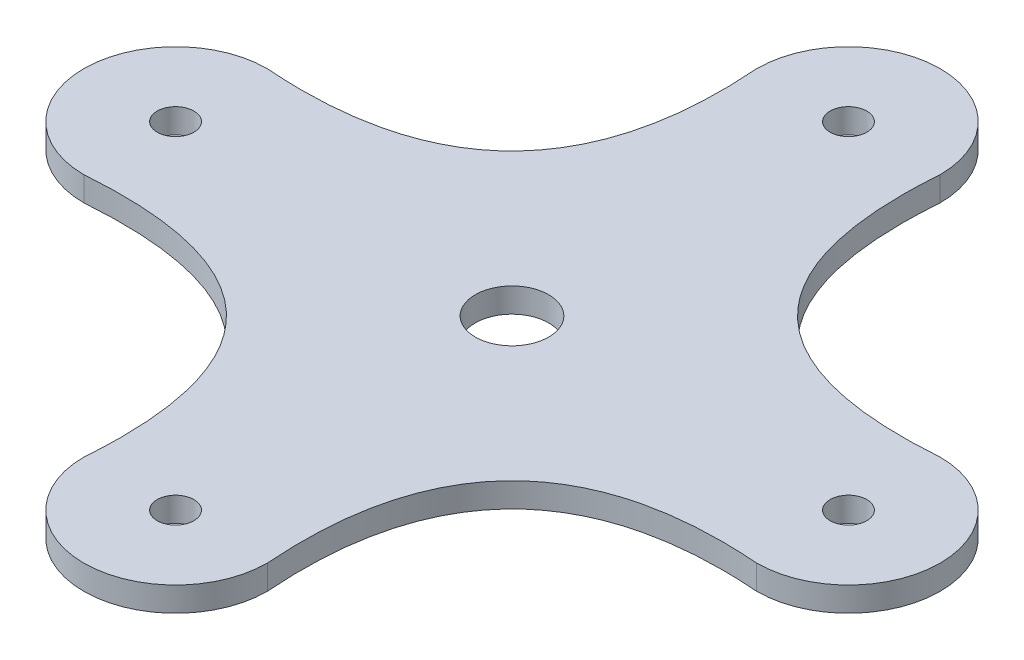
ISO-10303-21;
HEADER;
FILE_DESCRIPTION(('STEP AP214'),'2;1');
FILE_NAME('part.step','',(''),(''),'','','');
FILE_SCHEMA(('AUTOMOTIVE_DESIGN { 1 0 10303 214 1 1 1 1 }'));
ENDSEC;
DATA;
#1=APPLICATION_CONTEXT('core data for automotive mechanical design processes');
#2=APPLICATION_PROTOCOL_DEFINITION('international standard','automotive_design',2000,#1);
#3=PRODUCT_CONTEXT('',#1,'mechanical');
#4=PRODUCT('Part','Part','',(#3));
#5=PRODUCT_RELATED_PRODUCT_CATEGORY('part','',(#4));
#6=PRODUCT_DEFINITION_FORMATION('','',#4);
#7=PRODUCT_DEFINITION_CONTEXT('part definition',#1,'design');
#8=PRODUCT_DEFINITION('design','',#6,#7);
#9=PRODUCT_DEFINITION_SHAPE('','',#8);
#10=(LENGTH_UNIT() NAMED_UNIT(*) SI_UNIT(.MILLI.,.METRE.));
#11=(NAMED_UNIT(*) PLANE_ANGLE_UNIT() SI_UNIT($,.RADIAN.));
#12=(NAMED_UNIT(*) SI_UNIT($,.STERADIAN.) SOLID_ANGLE_UNIT());
#13=UNCERTAINTY_MEASURE_WITH_UNIT(LENGTH_MEASURE(1.E-05),#10,'distance_accuracy_value','');
#14=(GEOMETRIC_REPRESENTATION_CONTEXT(3) GLOBAL_UNCERTAINTY_ASSIGNED_CONTEXT((#13)) GLOBAL_UNIT_ASSIGNED_CONTEXT((#10,
#11,#12)) REPRESENTATION_CONTEXT('',''));
#15=CARTESIAN_POINT('',(0.,0.,0.));
#16=DIRECTION('',(0.,0.,1.));
#17=DIRECTION('',(1.,0.,0.));
#18=AXIS2_PLACEMENT_3D('',#15,#16,#17);
#19=CARTESIAN_POINT('',(27.5,2.,0.));
#20=DIRECTION('',(0.,-1.,0.));
#21=DIRECTION('',(0.,0.,-1.));
#22=AXIS2_PLACEMENT_3D('',#19,#20,#21);
#23=CYLINDRICAL_SURFACE('',#22,7.5);
#24=CARTESIAN_POINT('',(27.5,0.,0.));
#25=DIRECTION('',(0.,1.,0.));
#26=DIRECTION('',(0.,0.,1.));
#27=AXIS2_PLACEMENT_3D('',#24,#25,#26);
#28=CIRCLE('',#27,7.5);
#29=CARTESIAN_POINT('',(27.5,0.,7.5));
#30=VERTEX_POINT('',#29);
#31=CARTESIAN_POINT('',(27.5,0.,-7.5));
#32=VERTEX_POINT('',#31);
#33=EDGE_CURVE('E232',#30,#32,#28,.T.);
#34=ORIENTED_EDGE('',*,*,#33,.T.);
#35=DIRECTION('',(0.,-1.,0.));
#36=VECTOR('',#35,1.);
#37=CARTESIAN_POINT('',(27.5,2.,-7.5));
#38=LINE('',#37,#36);
#39=CARTESIAN_POINT('',(27.5,2.,-7.5));
#40=VERTEX_POINT('',#39);
#41=EDGE_CURVE('E11',#40,#32,#38,.T.);
#42=ORIENTED_EDGE('',*,*,#41,.F.);
#43=CARTESIAN_POINT('',(27.5,2.,0.));
#44=DIRECTION('',(0.,1.,0.));
#45=DIRECTION('',(0.,0.,1.));
#46=AXIS2_PLACEMENT_3D('',#43,#44,#45);
#47=CIRCLE('',#46,7.5);
#48=CARTESIAN_POINT('',(27.5,2.,7.5));
#49=VERTEX_POINT('',#48);
#50=EDGE_CURVE('E192',#49,#40,#47,.T.);
#51=ORIENTED_EDGE('',*,*,#50,.F.);
#52=DIRECTION('',(0.,-1.,0.));
#53=VECTOR('',#52,1.);
#54=CARTESIAN_POINT('',(27.5,2.,7.5));
#55=LINE('',#54,#53);
#56=EDGE_CURVE('E139',#49,#30,#55,.T.);
#57=ORIENTED_EDGE('',*,*,#56,.T.);
#58=EDGE_LOOP('',(#34,#42,#51,#57));
#59=FACE_BOUND('',#58,.T.);
#60=ADVANCED_FACE('F41',(#59),#23,.T.);
#61=CARTESIAN_POINT('',(27.5,2.,-7.5));
#62=CARTESIAN_POINT('',(5.83452377915606,2.,-5.83452377915607));
#63=CARTESIAN_POINT('',(7.5,2.,-27.5));
#64=B_SPLINE_CURVE_WITH_KNOTS('',2,(#61,#62,#63),.UNSPECIFIED.,.F.,.F.,(3,3),(0.,1.),.UNSPECIFIED.);
#65=DIRECTION('',(0.,-1.,0.));
#66=VECTOR('',#65,1.);
#67=SURFACE_OF_LINEAR_EXTRUSION('',#64,#66);
#68=CARTESIAN_POINT('',(27.5,0.,-7.5));
#69=CARTESIAN_POINT('',(5.83452377915606,0.,-5.83452377915607));
#70=CARTESIAN_POINT('',(7.5,0.,-27.5));
#71=B_SPLINE_CURVE_WITH_KNOTS('',2,(#68,#69,#70),.UNSPECIFIED.,.F.,.F.,(3,3),(0.,1.),.UNSPECIFIED.);
#72=CARTESIAN_POINT('',(7.50000000000001,0.,-27.5));
#73=VERTEX_POINT('',#72);
#74=EDGE_CURVE('E229',#32,#73,#71,.T.);
#75=ORIENTED_EDGE('',*,*,#74,.T.);
#76=DIRECTION('',(0.,-1.,0.));
#77=VECTOR('',#76,1.);
#78=CARTESIAN_POINT('',(7.50000000000001,2.,-27.5));
#79=LINE('',#78,#77);
#80=CARTESIAN_POINT('',(7.50000000000001,2.,-27.5));
#81=VERTEX_POINT('',#80);
#82=EDGE_CURVE('E51',#81,#73,#79,.T.);
#83=ORIENTED_EDGE('',*,*,#82,.F.);
#84=EDGE_CURVE('E102',#40,#81,#64,.T.);
#85=ORIENTED_EDGE('',*,*,#84,.F.);
#86=ORIENTED_EDGE('',*,*,#41,.T.);
#87=EDGE_LOOP('',(#75,#83,#85,#86));
#88=FACE_BOUND('',#87,.T.);
#89=ADVANCED_FACE('F266',(#88),#67,.F.);
#90=CARTESIAN_POINT('',(0.,2.,-27.5));
#91=DIRECTION('',(0.,-1.,0.));
#92=DIRECTION('',(0.,0.,-1.));
#93=AXIS2_PLACEMENT_3D('',#90,#91,#92);
#94=CYLINDRICAL_SURFACE('',#93,7.5);
#95=CARTESIAN_POINT('',(0.,0.,-27.5));
#96=DIRECTION('',(0.,1.,0.));
#97=DIRECTION('',(0.,0.,1.));
#98=AXIS2_PLACEMENT_3D('',#95,#96,#97);
#99=CIRCLE('',#98,7.5);
#100=CARTESIAN_POINT('',(-7.5,0.,-27.5));
#101=VERTEX_POINT('',#100);
#102=EDGE_CURVE('E226',#73,#101,#99,.T.);
#103=ORIENTED_EDGE('',*,*,#102,.T.);
#104=DIRECTION('',(0.,-1.,0.));
#105=VECTOR('',#104,1.);
#106=CARTESIAN_POINT('',(-7.5,2.,-27.5));
#107=LINE('',#106,#105);
#108=CARTESIAN_POINT('',(-7.5,2.,-27.5));
#109=VERTEX_POINT('',#108);
#110=EDGE_CURVE('E311',#109,#101,#107,.T.);
#111=ORIENTED_EDGE('',*,*,#110,.F.);
#112=CARTESIAN_POINT('',(0.,2.,-27.5));
#113=DIRECTION('',(0.,1.,0.));
#114=DIRECTION('',(0.,0.,1.));
#115=AXIS2_PLACEMENT_3D('',#112,#113,#114);
#116=CIRCLE('',#115,7.5);
#117=EDGE_CURVE('E183',#81,#109,#116,.T.);
#118=ORIENTED_EDGE('',*,*,#117,.F.);
#119=ORIENTED_EDGE('',*,*,#82,.T.);
#120=EDGE_LOOP('',(#103,#111,#118,#119));
#121=FACE_BOUND('',#120,.T.);
#122=ADVANCED_FACE('F174',(#121),#94,.T.);
#123=CARTESIAN_POINT('',(-7.5,2.,-27.5));
#124=CARTESIAN_POINT('',(-5.83452377915606,2.,-5.83452377915608));
#125=CARTESIAN_POINT('',(-27.5,2.,-7.5));
#126=B_SPLINE_CURVE_WITH_KNOTS('',2,(#123,#124,#125),.UNSPECIFIED.,.F.,.F.,(3,3),(0.,1.),.UNSPECIFIED.);
#127=DIRECTION('',(0.,-1.,0.));
#128=VECTOR('',#127,1.);
#129=SURFACE_OF_LINEAR_EXTRUSION('',#126,#128);
#130=CARTESIAN_POINT('',(-7.5,0.,-27.5));
#131=CARTESIAN_POINT('',(-5.83452377915606,0.,-5.83452377915608));
#132=CARTESIAN_POINT('',(-27.5,0.,-7.5));
#133=B_SPLINE_CURVE_WITH_KNOTS('',2,(#130,#131,#132),.UNSPECIFIED.,.F.,.F.,(3,3),(0.,1.),.UNSPECIFIED.);
#134=CARTESIAN_POINT('',(-27.5,0.,-7.5));
#135=VERTEX_POINT('',#134);
#136=EDGE_CURVE('E223',#101,#135,#133,.T.);
#137=ORIENTED_EDGE('',*,*,#136,.T.);
#138=DIRECTION('',(0.,-1.,0.));
#139=VECTOR('',#138,1.);
#140=CARTESIAN_POINT('',(-27.5,2.,-7.5));
#141=LINE('',#140,#139);
#142=CARTESIAN_POINT('',(-27.5,2.,-7.5));
#143=VERTEX_POINT('',#142);
#144=EDGE_CURVE('E307',#143,#135,#141,.T.);
#145=ORIENTED_EDGE('',*,*,#144,.F.);
#146=EDGE_CURVE('E177',#109,#143,#126,.T.);
#147=ORIENTED_EDGE('',*,*,#146,.F.);
#148=ORIENTED_EDGE('',*,*,#110,.T.);
#149=EDGE_LOOP('',(#137,#145,#147,#148));
#150=FACE_BOUND('',#149,.T.);
#151=ADVANCED_FACE('F169',(#150),#129,.F.);
#152=CARTESIAN_POINT('',(-27.5,2.,0.));
#153=DIRECTION('',(0.,-1.,0.));
#154=DIRECTION('',(0.,0.,-1.));
#155=AXIS2_PLACEMENT_3D('',#152,#153,#154);
#156=CYLINDRICAL_SURFACE('',#155,7.5);
#157=CARTESIAN_POINT('',(-27.5,0.,0.));
#158=DIRECTION('',(0.,1.,0.));
#159=DIRECTION('',(0.,0.,1.));
#160=AXIS2_PLACEMENT_3D('',#157,#158,#159);
#161=CIRCLE('',#160,7.5);
#162=CARTESIAN_POINT('',(-27.5,0.,7.5));
#163=VERTEX_POINT('',#162);
#164=EDGE_CURVE('E220',#135,#163,#161,.T.);
#165=ORIENTED_EDGE('',*,*,#164,.T.);
#166=DIRECTION('',(0.,-1.,0.));
#167=VECTOR('',#166,1.);
#168=CARTESIAN_POINT('',(-27.5,2.,7.5));
#169=LINE('',#168,#167);
#170=CARTESIAN_POINT('',(-27.5,2.,7.5));
#171=VERTEX_POINT('',#170);
#172=EDGE_CURVE('E132',#171,#163,#169,.T.);
#173=ORIENTED_EDGE('',*,*,#172,.F.);
#174=CARTESIAN_POINT('',(-27.5,2.,0.));
#175=DIRECTION('',(0.,1.,0.));
#176=DIRECTION('',(0.,0.,1.));
#177=AXIS2_PLACEMENT_3D('',#174,#175,#176);
#178=CIRCLE('',#177,7.5);
#179=EDGE_CURVE('E121',#143,#171,#178,.T.);
#180=ORIENTED_EDGE('',*,*,#179,.F.);
#181=ORIENTED_EDGE('',*,*,#144,.T.);
#182=EDGE_LOOP('',(#165,#173,#180,#181));
#183=FACE_BOUND('',#182,.T.);
#184=ADVANCED_FACE('F166',(#183),#156,.T.);
#185=CARTESIAN_POINT('',(-27.5,2.,7.5));
#186=CARTESIAN_POINT('',(-5.83452377915605,2.,5.83452377915608));
#187=CARTESIAN_POINT('',(-7.5,2.,27.5));
#188=B_SPLINE_CURVE_WITH_KNOTS('',2,(#185,#186,#187),.UNSPECIFIED.,.F.,.F.,(3,3),(0.,1.),.UNSPECIFIED.);
#189=DIRECTION('',(0.,-1.,0.));
#190=VECTOR('',#189,1.);
#191=SURFACE_OF_LINEAR_EXTRUSION('',#188,#190);
#192=CARTESIAN_POINT('',(-27.5,0.,7.5));
#193=CARTESIAN_POINT('',(-5.83452377915605,0.,5.83452377915608));
#194=CARTESIAN_POINT('',(-7.5,0.,27.5));
#195=B_SPLINE_CURVE_WITH_KNOTS('',2,(#192,#193,#194),.UNSPECIFIED.,.F.,.F.,(3,3),(0.,1.),.UNSPECIFIED.);
#196=CARTESIAN_POINT('',(-7.5,0.,27.5));
#197=VERTEX_POINT('',#196);
#198=EDGE_CURVE('E130',#163,#197,#195,.T.);
#199=ORIENTED_EDGE('',*,*,#198,.T.);
#200=DIRECTION('',(0.,-1.,0.));
#201=VECTOR('',#200,1.);
#202=CARTESIAN_POINT('',(-7.5,2.,27.5));
#203=LINE('',#202,#201);
#204=CARTESIAN_POINT('',(-7.5,2.,27.5));
#205=VERTEX_POINT('',#204);
#206=EDGE_CURVE('E127',#205,#197,#203,.T.);
#207=ORIENTED_EDGE('',*,*,#206,.F.);
#208=EDGE_CURVE('E115',#171,#205,#188,.T.);
#209=ORIENTED_EDGE('',*,*,#208,.F.);
#210=ORIENTED_EDGE('',*,*,#172,.T.);
#211=EDGE_LOOP('',(#199,#207,#209,#210));
#212=FACE_BOUND('',#211,.T.);
#213=ADVANCED_FACE('F128',(#212),#191,.F.);
#214=CARTESIAN_POINT('',(0.,2.,27.5));
#215=DIRECTION('',(0.,-1.,0.));
#216=DIRECTION('',(0.,0.,-1.));
#217=AXIS2_PLACEMENT_3D('',#214,#215,#216);
#218=CYLINDRICAL_SURFACE('',#217,7.5);
#219=CARTESIAN_POINT('',(0.,0.,27.5));
#220=DIRECTION('',(0.,1.,0.));
#221=DIRECTION('',(0.,0.,1.));
#222=AXIS2_PLACEMENT_3D('',#219,#220,#221);
#223=CIRCLE('',#222,7.5);
#224=CARTESIAN_POINT('',(7.50000000000001,0.,27.5));
#225=VERTEX_POINT('',#224);
#226=EDGE_CURVE('E88',#197,#225,#223,.T.);
#227=ORIENTED_EDGE('',*,*,#226,.T.);
#228=DIRECTION('',(0.,-1.,0.));
#229=VECTOR('',#228,1.);
#230=CARTESIAN_POINT('',(7.50000000000001,2.,27.5));
#231=LINE('',#230,#229);
#232=CARTESIAN_POINT('',(7.50000000000001,2.,27.5));
#233=VERTEX_POINT('',#232);
#234=EDGE_CURVE('E133',#233,#225,#231,.T.);
#235=ORIENTED_EDGE('',*,*,#234,.F.);
#236=CARTESIAN_POINT('',(0.,2.,27.5));
#237=DIRECTION('',(0.,1.,0.));
#238=DIRECTION('',(0.,0.,1.));
#239=AXIS2_PLACEMENT_3D('',#236,#237,#238);
#240=CIRCLE('',#239,7.5);
#241=EDGE_CURVE('E119',#205,#233,#240,.T.);
#242=ORIENTED_EDGE('',*,*,#241,.F.);
#243=ORIENTED_EDGE('',*,*,#206,.T.);
#244=EDGE_LOOP('',(#227,#235,#242,#243));
#245=FACE_BOUND('',#244,.T.);
#246=ADVANCED_FACE('F135',(#245),#218,.T.);
#247=CARTESIAN_POINT('',(0.,2.,0.));
#248=DIRECTION('',(0.,-1.,0.));
#249=DIRECTION('',(0.,0.,-1.));
#250=AXIS2_PLACEMENT_3D('',#247,#248,#249);
#251=CYLINDRICAL_SURFACE('',#250,3.);
#252=CARTESIAN_POINT('',(0.,2.,0.));
#253=DIRECTION('',(0.,1.,0.));
#254=DIRECTION('',(0.,0.,1.));
#255=AXIS2_PLACEMENT_3D('',#252,#253,#254);
#256=CIRCLE('',#255,3.);
#257=CARTESIAN_POINT('',(0.,2.,3.));
#258=VERTEX_POINT('',#257);
#259=EDGE_CURVE('E194',#258,#258,#256,.T.);
#260=ORIENTED_EDGE('',*,*,#259,.T.);
#261=EDGE_LOOP('',(#260));
#262=FACE_BOUND('',#261,.T.);
#263=CARTESIAN_POINT('',(0.,0.,0.));
#264=DIRECTION('',(0.,1.,0.));
#265=DIRECTION('',(0.,0.,1.));
#266=AXIS2_PLACEMENT_3D('',#263,#264,#265);
#267=CIRCLE('',#266,3.);
#268=CARTESIAN_POINT('',(0.,0.,3.));
#269=VERTEX_POINT('',#268);
#270=EDGE_CURVE('E236',#269,#269,#267,.T.);
#271=ORIENTED_EDGE('',*,*,#270,.F.);
#272=EDGE_LOOP('',(#271));
#273=FACE_BOUND('',#272,.T.);
#274=ADVANCED_FACE('F163',(#262,#273),#251,.F.);
#275=CARTESIAN_POINT('',(0.,2.,27.5));
#276=DIRECTION('',(0.,-1.,0.));
#277=DIRECTION('',(0.,0.,-1.));
#278=AXIS2_PLACEMENT_3D('',#275,#276,#277);
#279=CYLINDRICAL_SURFACE('',#278,1.5);
#280=CARTESIAN_POINT('',(0.,2.,27.5));
#281=DIRECTION('',(0.,1.,0.));
#282=DIRECTION('',(0.,0.,1.));
#283=AXIS2_PLACEMENT_3D('',#280,#281,#282);
#284=CIRCLE('',#283,1.5);
#285=CARTESIAN_POINT('',(0.,2.,29.));
#286=VERTEX_POINT('',#285);
#287=EDGE_CURVE('E198',#286,#286,#284,.T.);
#288=ORIENTED_EDGE('',*,*,#287,.T.);
#289=EDGE_LOOP('',(#288));
#290=FACE_BOUND('',#289,.T.);
#291=CARTESIAN_POINT('',(0.,0.,27.5));
#292=DIRECTION('',(0.,1.,0.));
#293=DIRECTION('',(0.,0.,1.));
#294=AXIS2_PLACEMENT_3D('',#291,#292,#293);
#295=CIRCLE('',#294,1.5);
#296=CARTESIAN_POINT('',(0.,0.,29.));
#297=VERTEX_POINT('',#296);
#298=EDGE_CURVE('E240',#297,#297,#295,.T.);
#299=ORIENTED_EDGE('',*,*,#298,.F.);
#300=EDGE_LOOP('',(#299));
#301=FACE_BOUND('',#300,.T.);
#302=ADVANCED_FACE('F275',(#290,#301),#279,.F.);
#303=CARTESIAN_POINT('',(27.5,2.,0.));
#304=DIRECTION('',(0.,-1.,0.));
#305=DIRECTION('',(0.,0.,-1.));
#306=AXIS2_PLACEMENT_3D('',#303,#304,#305);
#307=CYLINDRICAL_SURFACE('',#306,1.5);
#308=CARTESIAN_POINT('',(27.5,2.,0.));
#309=DIRECTION('',(0.,1.,0.));
#310=DIRECTION('',(0.,0.,1.));
#311=AXIS2_PLACEMENT_3D('',#308,#309,#310);
#312=CIRCLE('',#311,1.5);
#313=CARTESIAN_POINT('',(27.5,2.,1.5));
#314=VERTEX_POINT('',#313);
#315=EDGE_CURVE('E202',#314,#314,#312,.T.);
#316=ORIENTED_EDGE('',*,*,#315,.T.);
#317=EDGE_LOOP('',(#316));
#318=FACE_BOUND('',#317,.T.);
#319=CARTESIAN_POINT('',(27.5,0.,0.));
#320=DIRECTION('',(0.,1.,0.));
#321=DIRECTION('',(0.,0.,1.));
#322=AXIS2_PLACEMENT_3D('',#319,#320,#321);
#323=CIRCLE('',#322,1.5);
#324=CARTESIAN_POINT('',(27.5,0.,1.5));
#325=VERTEX_POINT('',#324);
#326=EDGE_CURVE('E244',#325,#325,#323,.T.);
#327=ORIENTED_EDGE('',*,*,#326,.F.);
#328=EDGE_LOOP('',(#327));
#329=FACE_BOUND('',#328,.T.);
#330=ADVANCED_FACE('F263',(#318,#329),#307,.F.);
#331=CARTESIAN_POINT('',(-27.5,2.,0.));
#332=DIRECTION('',(0.,-1.,0.));
#333=DIRECTION('',(0.,0.,-1.));
#334=AXIS2_PLACEMENT_3D('',#331,#332,#333);
#335=CYLINDRICAL_SURFACE('',#334,1.5);
#336=CARTESIAN_POINT('',(-27.5,2.,0.));
#337=DIRECTION('',(0.,1.,0.));
#338=DIRECTION('',(0.,0.,1.));
#339=AXIS2_PLACEMENT_3D('',#336,#337,#338);
#340=CIRCLE('',#339,1.5);
#341=CARTESIAN_POINT('',(-27.5,2.,1.5));
#342=VERTEX_POINT('',#341);
#343=EDGE_CURVE('E206',#342,#342,#340,.T.);
#344=ORIENTED_EDGE('',*,*,#343,.T.);
#345=EDGE_LOOP('',(#344));
#346=FACE_BOUND('',#345,.T.);
#347=CARTESIAN_POINT('',(-27.5,0.,0.));
#348=DIRECTION('',(0.,1.,0.));
#349=DIRECTION('',(0.,0.,1.));
#350=AXIS2_PLACEMENT_3D('',#347,#348,#349);
#351=CIRCLE('',#350,1.5);
#352=CARTESIAN_POINT('',(-27.5,0.,1.5));
#353=VERTEX_POINT('',#352);
#354=EDGE_CURVE('E248',#353,#353,#351,.T.);
#355=ORIENTED_EDGE('',*,*,#354,.F.);
#356=EDGE_LOOP('',(#355));
#357=FACE_BOUND('',#356,.T.);
#358=ADVANCED_FACE('F258',(#346,#357),#335,.F.);
#359=CARTESIAN_POINT('',(0.,2.,-27.5));
#360=DIRECTION('',(0.,-1.,0.));
#361=DIRECTION('',(0.,0.,-1.));
#362=AXIS2_PLACEMENT_3D('',#359,#360,#361);
#363=CYLINDRICAL_SURFACE('',#362,1.5);
#364=CARTESIAN_POINT('',(0.,2.,-27.5));
#365=DIRECTION('',(0.,1.,0.));
#366=DIRECTION('',(0.,0.,1.));
#367=AXIS2_PLACEMENT_3D('',#364,#365,#366);
#368=CIRCLE('',#367,1.5);
#369=CARTESIAN_POINT('',(0.,2.,-26.));
#370=VERTEX_POINT('',#369);
#371=EDGE_CURVE('E210',#370,#370,#368,.T.);
#372=ORIENTED_EDGE('',*,*,#371,.T.);
#373=EDGE_LOOP('',(#372));
#374=FACE_BOUND('',#373,.T.);
#375=CARTESIAN_POINT('',(0.,0.,-27.5));
#376=DIRECTION('',(0.,1.,0.));
#377=DIRECTION('',(0.,0.,1.));
#378=AXIS2_PLACEMENT_3D('',#375,#376,#377);
#379=CIRCLE('',#378,1.5);
#380=CARTESIAN_POINT('',(0.,0.,-26.));
#381=VERTEX_POINT('',#380);
#382=EDGE_CURVE('E149',#381,#381,#379,.T.);
#383=ORIENTED_EDGE('',*,*,#382,.F.);
#384=EDGE_LOOP('',(#383));
#385=FACE_BOUND('',#384,.T.);
#386=ADVANCED_FACE('F43',(#374,#385),#363,.F.);
#387=CARTESIAN_POINT('',(7.5,2.,27.5));
#388=CARTESIAN_POINT('',(5.83452377915606,2.,5.83452377915608));
#389=CARTESIAN_POINT('',(27.5,2.,7.5));
#390=B_SPLINE_CURVE_WITH_KNOTS('',2,(#387,#388,#389),.UNSPECIFIED.,.F.,.F.,(3,3),(0.,1.),.UNSPECIFIED.);
#391=DIRECTION('',(0.,-1.,0.));
#392=VECTOR('',#391,1.);
#393=SURFACE_OF_LINEAR_EXTRUSION('',#390,#392);
#394=CARTESIAN_POINT('',(7.5,0.,27.5));
#395=CARTESIAN_POINT('',(5.83452377915606,0.,5.83452377915608));
#396=CARTESIAN_POINT('',(27.5,0.,7.5));
#397=B_SPLINE_CURVE_WITH_KNOTS('',2,(#394,#395,#396),.UNSPECIFIED.,.F.,.F.,(3,3),(0.,1.),.UNSPECIFIED.);
#398=EDGE_CURVE('E94',#225,#30,#397,.T.);
#399=ORIENTED_EDGE('',*,*,#398,.T.);
#400=ORIENTED_EDGE('',*,*,#56,.F.);
#401=EDGE_CURVE('E59',#233,#49,#390,.T.);
#402=ORIENTED_EDGE('',*,*,#401,.F.);
#403=ORIENTED_EDGE('',*,*,#234,.T.);
#404=EDGE_LOOP('',(#399,#400,#402,#403));
#405=FACE_BOUND('',#404,.T.);
#406=ADVANCED_FACE('F155',(#405),#393,.F.);
#407=CARTESIAN_POINT('',(0.,2.,0.));
#408=DIRECTION('',(0.,1.,0.));
#409=DIRECTION('',(0.,0.,1.));
#410=AXIS2_PLACEMENT_3D('',#407,#408,#409);
#411=PLANE('',#410);
#412=ORIENTED_EDGE('',*,*,#371,.F.);
#413=EDGE_LOOP('',(#412));
#414=FACE_BOUND('',#413,.T.);
#415=ORIENTED_EDGE('',*,*,#343,.F.);
#416=EDGE_LOOP('',(#415));
#417=FACE_BOUND('',#416,.T.);
#418=ORIENTED_EDGE('',*,*,#315,.F.);
#419=EDGE_LOOP('',(#418));
#420=FACE_BOUND('',#419,.T.);
#421=ORIENTED_EDGE('',*,*,#287,.F.);
#422=EDGE_LOOP('',(#421));
#423=FACE_BOUND('',#422,.T.);
#424=ORIENTED_EDGE('',*,*,#259,.F.);
#425=EDGE_LOOP('',(#424));
#426=FACE_BOUND('',#425,.T.);
#427=ORIENTED_EDGE('',*,*,#50,.T.);
#428=ORIENTED_EDGE('',*,*,#84,.T.);
#429=ORIENTED_EDGE('',*,*,#117,.T.);
#430=ORIENTED_EDGE('',*,*,#146,.T.);
#431=ORIENTED_EDGE('',*,*,#179,.T.);
#432=ORIENTED_EDGE('',*,*,#208,.T.);
#433=ORIENTED_EDGE('',*,*,#241,.T.);
#434=ORIENTED_EDGE('',*,*,#401,.T.);
#435=EDGE_LOOP('',(#427,#428,#429,#430,#431,#432,#433,#434));
#436=FACE_BOUND('',#435,.T.);
#437=ADVANCED_FACE('F117',(#414,#417,#420,#423,#426,#436),#411,.T.);
#438=CARTESIAN_POINT('',(0.,0.,0.));
#439=DIRECTION('',(0.,1.,0.));
#440=DIRECTION('',(0.,0.,1.));
#441=AXIS2_PLACEMENT_3D('',#438,#439,#440);
#442=PLANE('',#441);
#443=ORIENTED_EDGE('',*,*,#382,.T.);
#444=EDGE_LOOP('',(#443));
#445=FACE_BOUND('',#444,.T.);
#446=ORIENTED_EDGE('',*,*,#354,.T.);
#447=EDGE_LOOP('',(#446));
#448=FACE_BOUND('',#447,.T.);
#449=ORIENTED_EDGE('',*,*,#326,.T.);
#450=EDGE_LOOP('',(#449));
#451=FACE_BOUND('',#450,.T.);
#452=ORIENTED_EDGE('',*,*,#298,.T.);
#453=EDGE_LOOP('',(#452));
#454=FACE_BOUND('',#453,.T.);
#455=ORIENTED_EDGE('',*,*,#270,.T.);
#456=EDGE_LOOP('',(#455));
#457=FACE_BOUND('',#456,.T.);
#458=ORIENTED_EDGE('',*,*,#33,.F.);
#459=ORIENTED_EDGE('',*,*,#398,.F.);
#460=ORIENTED_EDGE('',*,*,#226,.F.);
#461=ORIENTED_EDGE('',*,*,#198,.F.);
#462=ORIENTED_EDGE('',*,*,#164,.F.);
#463=ORIENTED_EDGE('',*,*,#136,.F.);
#464=ORIENTED_EDGE('',*,*,#102,.F.);
#465=ORIENTED_EDGE('',*,*,#74,.F.);
#466=EDGE_LOOP('',(#458,#459,#460,#461,#462,#463,#464,#465));
#467=FACE_BOUND('',#466,.T.);
#468=ADVANCED_FACE('F159',(#445,#448,#451,#454,#457,#467),#442,.F.);
#469=CLOSED_SHELL('',(#60,#89,#122,#151,#184,#213,#246,#274,#302,#330,#358,#386,#406,#437,#468));
#470=MANIFOLD_SOLID_BREP('B2',#469);
#471=ADVANCED_BREP_SHAPE_REPRESENTATION('',(#18,#470),#14);
#472=SHAPE_DEFINITION_REPRESENTATION(#9,#471);
ENDSEC;
END-ISO-10303-21;
